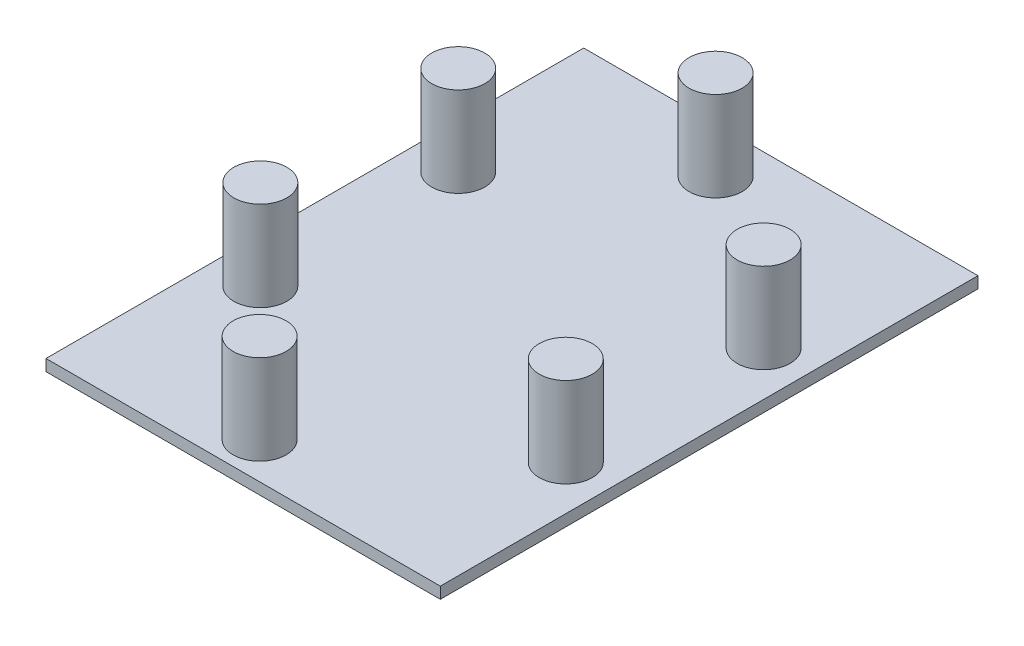
ISO-10303-21;
HEADER;
FILE_DESCRIPTION(('STEP AP214'),'2;1');
FILE_NAME('part.step','',(''),(''),'','','');
FILE_SCHEMA(('AUTOMOTIVE_DESIGN { 1 0 10303 214 1 1 1 1 }'));
ENDSEC;
DATA;
#1=APPLICATION_CONTEXT('core data for automotive mechanical design processes');
#2=APPLICATION_PROTOCOL_DEFINITION('international standard','automotive_design',2000,#1);
#3=PRODUCT_CONTEXT('',#1,'mechanical');
#4=PRODUCT('Part','Part','',(#3));
#5=PRODUCT_RELATED_PRODUCT_CATEGORY('part','',(#4));
#6=PRODUCT_DEFINITION_FORMATION('','',#4);
#7=PRODUCT_DEFINITION_CONTEXT('part definition',#1,'design');
#8=PRODUCT_DEFINITION('design','',#6,#7);
#9=PRODUCT_DEFINITION_SHAPE('','',#8);
#10=(LENGTH_UNIT() NAMED_UNIT(*) SI_UNIT(.MILLI.,.METRE.));
#11=(NAMED_UNIT(*) PLANE_ANGLE_UNIT() SI_UNIT($,.RADIAN.));
#12=(NAMED_UNIT(*) SI_UNIT($,.STERADIAN.) SOLID_ANGLE_UNIT());
#13=UNCERTAINTY_MEASURE_WITH_UNIT(LENGTH_MEASURE(1.E-05),#10,'distance_accuracy_value','');
#14=(GEOMETRIC_REPRESENTATION_CONTEXT(3) GLOBAL_UNCERTAINTY_ASSIGNED_CONTEXT((#13)) GLOBAL_UNIT_ASSIGNED_CONTEXT((#10,
#11,#12)) REPRESENTATION_CONTEXT('',''));
#15=CARTESIAN_POINT('',(0.,0.,0.));
#16=DIRECTION('',(0.,0.,1.));
#17=DIRECTION('',(1.,0.,0.));
#18=AXIS2_PLACEMENT_3D('',#15,#16,#17);
#19=CARTESIAN_POINT('',(-27.5,1.6,37.5));
#20=DIRECTION('',(0.,0.,-1.));
#21=DIRECTION('',(-1.,0.,0.));
#22=AXIS2_PLACEMENT_3D('',#19,#20,#21);
#23=PLANE('',#22);
#24=DIRECTION('',(1.,0.,0.));
#25=VECTOR('',#24,1.);
#26=CARTESIAN_POINT('',(-27.5,0.,37.5));
#27=LINE('',#26,#25);
#28=CARTESIAN_POINT('',(-27.5,0.,37.5));
#29=VERTEX_POINT('',#28);
#30=CARTESIAN_POINT('',(27.5,0.,37.5));
#31=VERTEX_POINT('',#30);
#32=EDGE_CURVE('E113',#29,#31,#27,.T.);
#33=ORIENTED_EDGE('',*,*,#32,.T.);
#34=DIRECTION('',(0.,-1.,0.));
#35=VECTOR('',#34,1.);
#36=CARTESIAN_POINT('',(27.5,1.6,37.5));
#37=LINE('',#36,#35);
#38=CARTESIAN_POINT('',(27.5,1.6,37.5));
#39=VERTEX_POINT('',#38);
#40=EDGE_CURVE('E11',#39,#31,#37,.T.);
#41=ORIENTED_EDGE('',*,*,#40,.F.);
#42=DIRECTION('',(1.,0.,0.));
#43=VECTOR('',#42,1.);
#44=CARTESIAN_POINT('',(-27.5,1.6,37.5));
#45=LINE('',#44,#43);
#46=CARTESIAN_POINT('',(-27.5,1.6,37.5));
#47=VERTEX_POINT('',#46);
#48=EDGE_CURVE('E98',#47,#39,#45,.T.);
#49=ORIENTED_EDGE('',*,*,#48,.F.);
#50=DIRECTION('',(0.,-1.,0.));
#51=VECTOR('',#50,1.);
#52=CARTESIAN_POINT('',(-27.5,1.6,37.5));
#53=LINE('',#52,#51);
#54=EDGE_CURVE('E63',#47,#29,#53,.T.);
#55=ORIENTED_EDGE('',*,*,#54,.T.);
#56=EDGE_LOOP('',(#33,#41,#49,#55));
#57=FACE_BOUND('',#56,.T.);
#58=ADVANCED_FACE('F46',(#57),#23,.F.);
#59=CARTESIAN_POINT('',(27.5,1.6,37.5));
#60=DIRECTION('',(-1.,0.,0.));
#61=DIRECTION('',(0.,0.,1.));
#62=AXIS2_PLACEMENT_3D('',#59,#60,#61);
#63=PLANE('',#62);
#64=DIRECTION('',(0.,0.,-1.));
#65=VECTOR('',#64,1.);
#66=CARTESIAN_POINT('',(27.5,0.,37.5));
#67=LINE('',#66,#65);
#68=CARTESIAN_POINT('',(27.5,0.,-37.5));
#69=VERTEX_POINT('',#68);
#70=EDGE_CURVE('E104',#31,#69,#67,.T.);
#71=ORIENTED_EDGE('',*,*,#70,.T.);
#72=DIRECTION('',(0.,-1.,0.));
#73=VECTOR('',#72,1.);
#74=CARTESIAN_POINT('',(27.5,1.6,-37.5));
#75=LINE('',#74,#73);
#76=CARTESIAN_POINT('',(27.5,1.6,-37.5));
#77=VERTEX_POINT('',#76);
#78=EDGE_CURVE('E55',#77,#69,#75,.T.);
#79=ORIENTED_EDGE('',*,*,#78,.F.);
#80=DIRECTION('',(0.,0.,-1.));
#81=VECTOR('',#80,1.);
#82=CARTESIAN_POINT('',(27.5,1.6,37.5));
#83=LINE('',#82,#81);
#84=EDGE_CURVE('E90',#39,#77,#83,.T.);
#85=ORIENTED_EDGE('',*,*,#84,.F.);
#86=ORIENTED_EDGE('',*,*,#40,.T.);
#87=EDGE_LOOP('',(#71,#79,#85,#86));
#88=FACE_BOUND('',#87,.T.);
#89=ADVANCED_FACE('F103',(#88),#63,.F.);
#90=CARTESIAN_POINT('',(-27.5,1.6,-37.5));
#91=DIRECTION('',(0.,0.,-1.));
#92=DIRECTION('',(-1.,0.,0.));
#93=AXIS2_PLACEMENT_3D('',#90,#91,#92);
#94=PLANE('',#93);
#95=DIRECTION('',(1.,0.,0.));
#96=VECTOR('',#95,1.);
#97=CARTESIAN_POINT('',(-27.5,0.,-37.5));
#98=LINE('',#97,#96);
#99=CARTESIAN_POINT('',(-27.5,0.,-37.5));
#100=VERTEX_POINT('',#99);
#101=EDGE_CURVE('E119',#100,#69,#98,.T.);
#102=ORIENTED_EDGE('',*,*,#101,.F.);
#103=DIRECTION('',(0.,-1.,0.));
#104=VECTOR('',#103,1.);
#105=CARTESIAN_POINT('',(-27.5,1.6,-37.5));
#106=LINE('',#105,#104);
#107=CARTESIAN_POINT('',(-27.5,1.6,-37.5));
#108=VERTEX_POINT('',#107);
#109=EDGE_CURVE('E78',#108,#100,#106,.T.);
#110=ORIENTED_EDGE('',*,*,#109,.F.);
#111=DIRECTION('',(1.,0.,0.));
#112=VECTOR('',#111,1.);
#113=CARTESIAN_POINT('',(-27.5,1.6,-37.5));
#114=LINE('',#113,#112);
#115=EDGE_CURVE('E97',#108,#77,#114,.T.);
#116=ORIENTED_EDGE('',*,*,#115,.T.);
#117=ORIENTED_EDGE('',*,*,#78,.T.);
#118=EDGE_LOOP('',(#102,#110,#116,#117));
#119=FACE_BOUND('',#118,.T.);
#120=ADVANCED_FACE('F107',(#119),#94,.T.);
#121=CARTESIAN_POINT('',(-27.5,1.6,37.5));
#122=DIRECTION('',(-1.,0.,0.));
#123=DIRECTION('',(0.,0.,1.));
#124=AXIS2_PLACEMENT_3D('',#121,#122,#123);
#125=PLANE('',#124);
#126=DIRECTION('',(0.,0.,-1.));
#127=VECTOR('',#126,1.);
#128=CARTESIAN_POINT('',(-27.5,0.,37.5));
#129=LINE('',#128,#127);
#130=EDGE_CURVE('E121',#29,#100,#129,.T.);
#131=ORIENTED_EDGE('',*,*,#130,.F.);
#132=ORIENTED_EDGE('',*,*,#54,.F.);
#133=DIRECTION('',(0.,0.,-1.));
#134=VECTOR('',#133,1.);
#135=CARTESIAN_POINT('',(-27.5,1.6,37.5));
#136=LINE('',#135,#134);
#137=EDGE_CURVE('E108',#47,#108,#136,.T.);
#138=ORIENTED_EDGE('',*,*,#137,.T.);
#139=ORIENTED_EDGE('',*,*,#109,.T.);
#140=EDGE_LOOP('',(#131,#132,#138,#139));
#141=FACE_BOUND('',#140,.T.);
#142=ADVANCED_FACE('F175',(#141),#125,.T.);
#143=CARTESIAN_POINT('',(0.,1.6,0.));
#144=DIRECTION('',(0.,1.,0.));
#145=DIRECTION('',(0.,0.,1.));
#146=AXIS2_PLACEMENT_3D('',#143,#144,#145);
#147=PLANE('',#146);
#148=CARTESIAN_POINT('',(21.3,1.6,13.8));
#149=DIRECTION('',(0.,1.,0.));
#150=DIRECTION('',(0.,0.,1.));
#151=AXIS2_PLACEMENT_3D('',#148,#149,#150);
#152=CIRCLE('',#151,3.7);
#153=CARTESIAN_POINT('',(21.3,1.6,17.5));
#154=VERTEX_POINT('',#153);
#155=EDGE_CURVE('E158',#154,#154,#152,.T.);
#156=ORIENTED_EDGE('',*,*,#155,.F.);
#157=EDGE_LOOP('',(#156));
#158=FACE_BOUND('',#157,.T.);
#159=CARTESIAN_POINT('',(21.3,1.6,-13.8));
#160=DIRECTION('',(0.,1.,0.));
#161=DIRECTION('',(0.,0.,1.));
#162=AXIS2_PLACEMENT_3D('',#159,#160,#161);
#163=CIRCLE('',#162,3.7);
#164=CARTESIAN_POINT('',(21.3,1.6,-10.1));
#165=VERTEX_POINT('',#164);
#166=EDGE_CURVE('E151',#165,#165,#163,.T.);
#167=ORIENTED_EDGE('',*,*,#166,.F.);
#168=EDGE_LOOP('',(#167));
#169=FACE_BOUND('',#168,.T.);
#170=CARTESIAN_POINT('',(-2.80000000000003,1.6,-31.2));
#171=DIRECTION('',(0.,1.,0.));
#172=DIRECTION('',(0.,0.,1.));
#173=AXIS2_PLACEMENT_3D('',#170,#171,#172);
#174=CIRCLE('',#173,3.7);
#175=CARTESIAN_POINT('',(-2.80000000000003,1.6,-27.5));
#176=VERTEX_POINT('',#175);
#177=EDGE_CURVE('E145',#176,#176,#174,.T.);
#178=ORIENTED_EDGE('',*,*,#177,.F.);
#179=EDGE_LOOP('',(#178));
#180=FACE_BOUND('',#179,.T.);
#181=CARTESIAN_POINT('',(-21.3,1.6,-13.8));
#182=DIRECTION('',(0.,1.,0.));
#183=DIRECTION('',(0.,0.,1.));
#184=AXIS2_PLACEMENT_3D('',#181,#182,#183);
#185=CIRCLE('',#184,3.7);
#186=CARTESIAN_POINT('',(-21.3,1.6,-10.1));
#187=VERTEX_POINT('',#186);
#188=EDGE_CURVE('E139',#187,#187,#185,.T.);
#189=ORIENTED_EDGE('',*,*,#188,.F.);
#190=EDGE_LOOP('',(#189));
#191=FACE_BOUND('',#190,.T.);
#192=CARTESIAN_POINT('',(-21.3,1.6,13.8));
#193=DIRECTION('',(0.,1.,0.));
#194=DIRECTION('',(0.,0.,1.));
#195=AXIS2_PLACEMENT_3D('',#192,#193,#194);
#196=CIRCLE('',#195,3.7);
#197=CARTESIAN_POINT('',(-21.3,1.6,17.5));
#198=VERTEX_POINT('',#197);
#199=EDGE_CURVE('E132',#198,#198,#196,.T.);
#200=ORIENTED_EDGE('',*,*,#199,.F.);
#201=EDGE_LOOP('',(#200));
#202=FACE_BOUND('',#201,.T.);
#203=CARTESIAN_POINT('',(-2.80000000000003,1.6,32.4));
#204=DIRECTION('',(0.,1.,0.));
#205=DIRECTION('',(0.,0.,1.));
#206=AXIS2_PLACEMENT_3D('',#203,#204,#205);
#207=CIRCLE('',#206,3.7);
#208=CARTESIAN_POINT('',(-2.80000000000003,1.6,36.1));
#209=VERTEX_POINT('',#208);
#210=EDGE_CURVE('E129',#209,#209,#207,.T.);
#211=ORIENTED_EDGE('',*,*,#210,.F.);
#212=EDGE_LOOP('',(#211));
#213=FACE_BOUND('',#212,.T.);
#214=ORIENTED_EDGE('',*,*,#48,.T.);
#215=ORIENTED_EDGE('',*,*,#84,.T.);
#216=ORIENTED_EDGE('',*,*,#115,.F.);
#217=ORIENTED_EDGE('',*,*,#137,.F.);
#218=EDGE_LOOP('',(#214,#215,#216,#217));
#219=FACE_BOUND('',#218,.T.);
#220=ADVANCED_FACE('F94',(#158,#169,#180,#191,#202,#213,#219),#147,.T.);
#221=CARTESIAN_POINT('',(0.,0.,0.));
#222=DIRECTION('',(0.,1.,0.));
#223=DIRECTION('',(0.,0.,1.));
#224=AXIS2_PLACEMENT_3D('',#221,#222,#223);
#225=PLANE('',#224);
#226=ORIENTED_EDGE('',*,*,#32,.F.);
#227=ORIENTED_EDGE('',*,*,#130,.T.);
#228=ORIENTED_EDGE('',*,*,#101,.T.);
#229=ORIENTED_EDGE('',*,*,#70,.F.);
#230=EDGE_LOOP('',(#226,#227,#228,#229));
#231=FACE_BOUND('',#230,.T.);
#232=ADVANCED_FACE('F174',(#231),#225,.F.);
#233=CARTESIAN_POINT('',(-2.80000000000003,14.1,32.4));
#234=DIRECTION('',(0.,-1.,0.));
#235=DIRECTION('',(0.,0.,-1.));
#236=AXIS2_PLACEMENT_3D('',#233,#234,#235);
#237=CYLINDRICAL_SURFACE('',#236,3.7);
#238=CARTESIAN_POINT('',(-2.80000000000003,14.1,32.4));
#239=DIRECTION('',(0.,1.,0.));
#240=DIRECTION('',(0.,0.,1.));
#241=AXIS2_PLACEMENT_3D('',#238,#239,#240);
#242=CIRCLE('',#241,3.7);
#243=CARTESIAN_POINT('',(-2.80000000000003,14.1,36.1));
#244=VERTEX_POINT('',#243);
#245=EDGE_CURVE('E116',#244,#244,#242,.T.);
#246=ORIENTED_EDGE('',*,*,#245,.F.);
#247=EDGE_LOOP('',(#246));
#248=FACE_BOUND('',#247,.T.);
#249=ORIENTED_EDGE('',*,*,#210,.T.);
#250=EDGE_LOOP('',(#249));
#251=FACE_BOUND('',#250,.T.);
#252=ADVANCED_FACE('F187',(#248,#251),#237,.T.);
#253=CARTESIAN_POINT('',(-2.80000000000003,14.1,32.4));
#254=DIRECTION('',(0.,1.,0.));
#255=DIRECTION('',(0.,0.,1.));
#256=AXIS2_PLACEMENT_3D('',#253,#254,#255);
#257=PLANE('',#256);
#258=ORIENTED_EDGE('',*,*,#245,.T.);
#259=EDGE_LOOP('',(#258));
#260=FACE_BOUND('',#259,.T.);
#261=ADVANCED_FACE('F189',(#260),#257,.T.);
#262=CARTESIAN_POINT('',(-21.3,14.1,13.8));
#263=DIRECTION('',(0.,-1.,0.));
#264=DIRECTION('',(0.,0.,-1.));
#265=AXIS2_PLACEMENT_3D('',#262,#263,#264);
#266=CYLINDRICAL_SURFACE('',#265,3.7);
#267=CARTESIAN_POINT('',(-21.3,14.1,13.8));
#268=DIRECTION('',(0.,1.,0.));
#269=DIRECTION('',(0.,0.,1.));
#270=AXIS2_PLACEMENT_3D('',#267,#268,#269);
#271=CIRCLE('',#270,3.7);
#272=CARTESIAN_POINT('',(-21.3,14.1,17.5));
#273=VERTEX_POINT('',#272);
#274=EDGE_CURVE('E136',#273,#273,#271,.T.);
#275=ORIENTED_EDGE('',*,*,#274,.F.);
#276=EDGE_LOOP('',(#275));
#277=FACE_BOUND('',#276,.T.);
#278=ORIENTED_EDGE('',*,*,#199,.T.);
#279=EDGE_LOOP('',(#278));
#280=FACE_BOUND('',#279,.T.);
#281=ADVANCED_FACE('F196',(#277,#280),#266,.T.);
#282=CARTESIAN_POINT('',(-21.3,14.1,13.8));
#283=DIRECTION('',(0.,1.,0.));
#284=DIRECTION('',(0.,0.,1.));
#285=AXIS2_PLACEMENT_3D('',#282,#283,#284);
#286=PLANE('',#285);
#287=ORIENTED_EDGE('',*,*,#274,.T.);
#288=EDGE_LOOP('',(#287));
#289=FACE_BOUND('',#288,.T.);
#290=ADVANCED_FACE('F266',(#289),#286,.T.);
#291=CARTESIAN_POINT('',(-21.3,14.1,-13.8));
#292=DIRECTION('',(0.,-1.,0.));
#293=DIRECTION('',(0.,0.,-1.));
#294=AXIS2_PLACEMENT_3D('',#291,#292,#293);
#295=CYLINDRICAL_SURFACE('',#294,3.7);
#296=CARTESIAN_POINT('',(-21.3,14.1,-13.8));
#297=DIRECTION('',(0.,1.,0.));
#298=DIRECTION('',(0.,0.,1.));
#299=AXIS2_PLACEMENT_3D('',#296,#297,#298);
#300=CIRCLE('',#299,3.7);
#301=CARTESIAN_POINT('',(-21.3,14.1,-10.1));
#302=VERTEX_POINT('',#301);
#303=EDGE_CURVE('E142',#302,#302,#300,.T.);
#304=ORIENTED_EDGE('',*,*,#303,.F.);
#305=EDGE_LOOP('',(#304));
#306=FACE_BOUND('',#305,.T.);
#307=ORIENTED_EDGE('',*,*,#188,.T.);
#308=EDGE_LOOP('',(#307));
#309=FACE_BOUND('',#308,.T.);
#310=ADVANCED_FACE('F276',(#306,#309),#295,.T.);
#311=CARTESIAN_POINT('',(-21.3,14.1,-13.8));
#312=DIRECTION('',(0.,1.,0.));
#313=DIRECTION('',(0.,0.,1.));
#314=AXIS2_PLACEMENT_3D('',#311,#312,#313);
#315=PLANE('',#314);
#316=ORIENTED_EDGE('',*,*,#303,.T.);
#317=EDGE_LOOP('',(#316));
#318=FACE_BOUND('',#317,.T.);
#319=ADVANCED_FACE('F286',(#318),#315,.T.);
#320=CARTESIAN_POINT('',(-2.80000000000003,14.1,-31.2));
#321=DIRECTION('',(0.,-1.,0.));
#322=DIRECTION('',(0.,0.,-1.));
#323=AXIS2_PLACEMENT_3D('',#320,#321,#322);
#324=CYLINDRICAL_SURFACE('',#323,3.7);
#325=CARTESIAN_POINT('',(-2.80000000000003,14.1,-31.2));
#326=DIRECTION('',(0.,1.,0.));
#327=DIRECTION('',(0.,0.,1.));
#328=AXIS2_PLACEMENT_3D('',#325,#326,#327);
#329=CIRCLE('',#328,3.7);
#330=CARTESIAN_POINT('',(-2.80000000000003,14.1,-27.5));
#331=VERTEX_POINT('',#330);
#332=EDGE_CURVE('E148',#331,#331,#329,.T.);
#333=ORIENTED_EDGE('',*,*,#332,.F.);
#334=EDGE_LOOP('',(#333));
#335=FACE_BOUND('',#334,.T.);
#336=ORIENTED_EDGE('',*,*,#177,.T.);
#337=EDGE_LOOP('',(#336));
#338=FACE_BOUND('',#337,.T.);
#339=ADVANCED_FACE('F296',(#335,#338),#324,.T.);
#340=CARTESIAN_POINT('',(-2.80000000000003,14.1,-31.2));
#341=DIRECTION('',(0.,1.,0.));
#342=DIRECTION('',(0.,0.,1.));
#343=AXIS2_PLACEMENT_3D('',#340,#341,#342);
#344=PLANE('',#343);
#345=ORIENTED_EDGE('',*,*,#332,.T.);
#346=EDGE_LOOP('',(#345));
#347=FACE_BOUND('',#346,.T.);
#348=ADVANCED_FACE('F306',(#347),#344,.T.);
#349=CARTESIAN_POINT('',(21.3,14.1,-13.8));
#350=DIRECTION('',(0.,-1.,0.));
#351=DIRECTION('',(0.,0.,-1.));
#352=AXIS2_PLACEMENT_3D('',#349,#350,#351);
#353=CYLINDRICAL_SURFACE('',#352,3.7);
#354=CARTESIAN_POINT('',(21.3,14.1,-13.8));
#355=DIRECTION('',(0.,1.,0.));
#356=DIRECTION('',(0.,0.,1.));
#357=AXIS2_PLACEMENT_3D('',#354,#355,#356);
#358=CIRCLE('',#357,3.7);
#359=CARTESIAN_POINT('',(21.3,14.1,-10.1));
#360=VERTEX_POINT('',#359);
#361=EDGE_CURVE('E154',#360,#360,#358,.T.);
#362=ORIENTED_EDGE('',*,*,#361,.F.);
#363=EDGE_LOOP('',(#362));
#364=FACE_BOUND('',#363,.T.);
#365=ORIENTED_EDGE('',*,*,#166,.T.);
#366=EDGE_LOOP('',(#365));
#367=FACE_BOUND('',#366,.T.);
#368=ADVANCED_FACE('F316',(#364,#367),#353,.T.);
#369=CARTESIAN_POINT('',(21.3,14.1,-13.8));
#370=DIRECTION('',(0.,1.,0.));
#371=DIRECTION('',(0.,0.,1.));
#372=AXIS2_PLACEMENT_3D('',#369,#370,#371);
#373=PLANE('',#372);
#374=ORIENTED_EDGE('',*,*,#361,.T.);
#375=EDGE_LOOP('',(#374));
#376=FACE_BOUND('',#375,.T.);
#377=ADVANCED_FACE('F326',(#376),#373,.T.);
#378=CARTESIAN_POINT('',(21.3,14.1,13.8));
#379=DIRECTION('',(0.,-1.,0.));
#380=DIRECTION('',(0.,0.,-1.));
#381=AXIS2_PLACEMENT_3D('',#378,#379,#380);
#382=CYLINDRICAL_SURFACE('',#381,3.7);
#383=CARTESIAN_POINT('',(21.3,14.1,13.8));
#384=DIRECTION('',(0.,1.,0.));
#385=DIRECTION('',(0.,0.,1.));
#386=AXIS2_PLACEMENT_3D('',#383,#384,#385);
#387=CIRCLE('',#386,3.7);
#388=CARTESIAN_POINT('',(21.3,14.1,17.5));
#389=VERTEX_POINT('',#388);
#390=EDGE_CURVE('E162',#389,#389,#387,.T.);
#391=ORIENTED_EDGE('',*,*,#390,.F.);
#392=EDGE_LOOP('',(#391));
#393=FACE_BOUND('',#392,.T.);
#394=ORIENTED_EDGE('',*,*,#155,.T.);
#395=EDGE_LOOP('',(#394));
#396=FACE_BOUND('',#395,.T.);
#397=ADVANCED_FACE('F170',(#393,#396),#382,.T.);
#398=CARTESIAN_POINT('',(21.3,14.1,13.8));
#399=DIRECTION('',(0.,1.,0.));
#400=DIRECTION('',(0.,0.,1.));
#401=AXIS2_PLACEMENT_3D('',#398,#399,#400);
#402=PLANE('',#401);
#403=ORIENTED_EDGE('',*,*,#390,.T.);
#404=EDGE_LOOP('',(#403));
#405=FACE_BOUND('',#404,.T.);
#406=ADVANCED_FACE('F345',(#405),#402,.T.);
#407=CLOSED_SHELL('',(#58,#89,#120,#142,#220,#232,#252,#261,#281,#290,#310,#319,#339,#348,#368,
#377,#397,#406));
#408=MANIFOLD_SOLID_BREP('B2',#407);
#409=ADVANCED_BREP_SHAPE_REPRESENTATION('',(#18,#408),#14);
#410=SHAPE_DEFINITION_REPRESENTATION(#9,#409);
ENDSEC;
END-ISO-10303-21;
